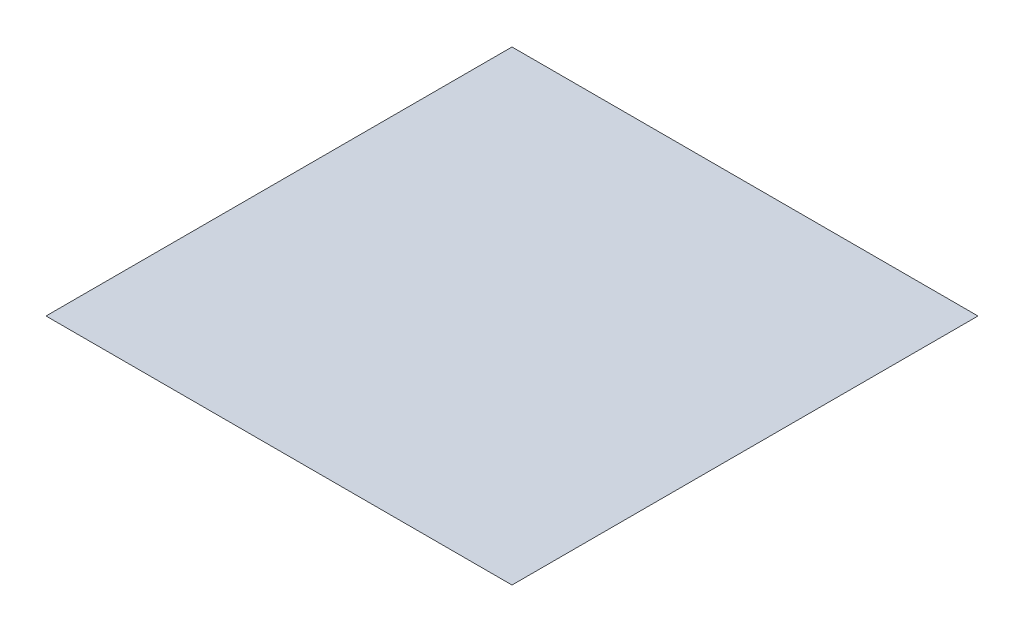
ISO-10303-21;
HEADER;
FILE_DESCRIPTION(('STEP AP214'),'2;1');
FILE_NAME('part.step','',(''),(''),'','','');
FILE_SCHEMA(('AUTOMOTIVE_DESIGN { 1 0 10303 214 1 1 1 1 }'));
ENDSEC;
DATA;
#1=APPLICATION_CONTEXT('core data for automotive mechanical design processes');
#2=APPLICATION_PROTOCOL_DEFINITION('international standard','automotive_design',2000,#1);
#3=PRODUCT_CONTEXT('',#1,'mechanical');
#4=PRODUCT('Part','Part','',(#3));
#5=PRODUCT_RELATED_PRODUCT_CATEGORY('part','',(#4));
#6=PRODUCT_DEFINITION_FORMATION('','',#4);
#7=PRODUCT_DEFINITION_CONTEXT('part definition',#1,'design');
#8=PRODUCT_DEFINITION('design','',#6,#7);
#9=PRODUCT_DEFINITION_SHAPE('','',#8);
#10=(LENGTH_UNIT() NAMED_UNIT(*) SI_UNIT(.MILLI.,.METRE.));
#11=(NAMED_UNIT(*) PLANE_ANGLE_UNIT() SI_UNIT($,.RADIAN.));
#12=(NAMED_UNIT(*) SI_UNIT($,.STERADIAN.) SOLID_ANGLE_UNIT());
#13=UNCERTAINTY_MEASURE_WITH_UNIT(LENGTH_MEASURE(1.E-05),#10,'distance_accuracy_value','');
#14=(GEOMETRIC_REPRESENTATION_CONTEXT(3) GLOBAL_UNCERTAINTY_ASSIGNED_CONTEXT((#13)) GLOBAL_UNIT_ASSIGNED_CONTEXT((#10,
#11,#12)) REPRESENTATION_CONTEXT('',''));
#15=CARTESIAN_POINT('',(0.,0.,0.));
#16=DIRECTION('',(0.,0.,1.));
#17=DIRECTION('',(1.,0.,0.));
#18=AXIS2_PLACEMENT_3D('',#15,#16,#17);
#19=CARTESIAN_POINT('',(0.,0.,0.));
#20=DIRECTION('',(0.,-1.,0.));
#21=DIRECTION('',(0.,0.,-1.));
#22=AXIS2_PLACEMENT_3D('',#19,#20,#21);
#23=PLANE('',#22);
#24=DIRECTION('',(0.,0.,-1.));
#25=VECTOR('',#24,1.);
#26=CARTESIAN_POINT('',(500.,0.,500.));
#27=LINE('',#26,#25);
#28=CARTESIAN_POINT('',(500.,0.,500.));
#29=VERTEX_POINT('',#28);
#30=CARTESIAN_POINT('',(500.,0.,-500.));
#31=VERTEX_POINT('',#30);
#32=EDGE_CURVE('E152',#29,#31,#27,.T.);
#33=ORIENTED_EDGE('',*,*,#32,.T.);
#34=DIRECTION('',(-1.,0.,0.));
#35=VECTOR('',#34,1.);
#36=CARTESIAN_POINT('',(-500.,0.,-500.));
#37=LINE('',#36,#35);
#38=CARTESIAN_POINT('',(-500.,0.,-500.));
#39=VERTEX_POINT('',#38);
#40=EDGE_CURVE('E70',#31,#39,#37,.T.);
#41=ORIENTED_EDGE('',*,*,#40,.T.);
#42=DIRECTION('',(0.,0.,1.));
#43=VECTOR('',#42,1.);
#44=CARTESIAN_POINT('',(-500.,0.,500.));
#45=LINE('',#44,#43);
#46=CARTESIAN_POINT('',(-500.,0.,500.));
#47=VERTEX_POINT('',#46);
#48=EDGE_CURVE('E218',#39,#47,#45,.T.);
#49=ORIENTED_EDGE('',*,*,#48,.T.);
#50=DIRECTION('',(1.,0.,0.));
#51=VECTOR('',#50,1.);
#52=CARTESIAN_POINT('',(-500.,0.,500.));
#53=LINE('',#52,#51);
#54=EDGE_CURVE('E158',#47,#29,#53,.T.);
#55=ORIENTED_EDGE('',*,*,#54,.T.);
#56=EDGE_LOOP('',(#33,#41,#49,#55));
#57=FACE_BOUND('',#56,.T.);
#58=ADVANCED_FACE('F45',(#57),#23,.F.);
#59=CARTESIAN_POINT('',(-195.121951219512,-243.90243902439,0.));
#60=DIRECTION('',(0.624695047554424,0.78086880944303,0.));
#61=DIRECTION('',(-0.78086880944303,0.624695047554424,0.));
#62=AXIS2_PLACEMENT_3D('',#59,#60,#61);
#63=PLANE('',#62);
#64=DIRECTION('',(0.615457454896664,-0.492365963917331,0.615457454896664));
#65=VECTOR('',#64,1.);
#66=CARTESIAN_POINT('',(-500.,0.,-500.));
#67=LINE('',#66,#65);
#68=CARTESIAN_POINT('',(-75.0000000000011,-340.000000000001,-74.9999999999985));
#69=VERTEX_POINT('',#68);
#70=EDGE_CURVE('E217',#39,#69,#67,.T.);
#71=ORIENTED_EDGE('',*,*,#70,.T.);
#72=DIRECTION('',(0.,0.,1.));
#73=VECTOR('',#72,1.);
#74=CARTESIAN_POINT('',(-75.0000000000011,-339.999999999999,0.));
#75=LINE('',#74,#73);
#76=CARTESIAN_POINT('',(-75.0000000000011,-339.999999999999,75.0000000000015));
#77=VERTEX_POINT('',#76);
#78=EDGE_CURVE('E111',#69,#77,#75,.T.);
#79=ORIENTED_EDGE('',*,*,#78,.T.);
#80=DIRECTION('',(0.615457454896664,-0.492365963917331,-0.615457454896664));
#81=VECTOR('',#80,1.);
#82=CARTESIAN_POINT('',(-500.,0.,500.));
#83=LINE('',#82,#81);
#84=EDGE_CURVE('E164',#47,#77,#83,.T.);
#85=ORIENTED_EDGE('',*,*,#84,.F.);
#86=ORIENTED_EDGE('',*,*,#48,.F.);
#87=EDGE_LOOP('',(#71,#79,#85,#86));
#88=FACE_BOUND('',#87,.T.);
#89=ADVANCED_FACE('F176',(#88),#63,.F.);
#90=CARTESIAN_POINT('',(0.,-243.90243902439,195.121951219512));
#91=DIRECTION('',(0.,0.78086880944303,-0.624695047554424));
#92=DIRECTION('',(0.,0.624695047554424,0.78086880944303));
#93=AXIS2_PLACEMENT_3D('',#90,#91,#92);
#94=PLANE('',#93);
#95=ORIENTED_EDGE('',*,*,#84,.T.);
#96=DIRECTION('',(1.,0.,0.));
#97=VECTOR('',#96,1.);
#98=CARTESIAN_POINT('',(0.,-339.999999999999,75.0000000000015));
#99=LINE('',#98,#97);
#100=CARTESIAN_POINT('',(74.9999999999989,-340.000000000001,75.0000000000015));
#101=VERTEX_POINT('',#100);
#102=EDGE_CURVE('E146',#77,#101,#99,.T.);
#103=ORIENTED_EDGE('',*,*,#102,.T.);
#104=DIRECTION('',(-0.615457454896663,-0.492365963917331,-0.615457454896664));
#105=VECTOR('',#104,1.);
#106=CARTESIAN_POINT('',(500.,0.,500.));
#107=LINE('',#106,#105);
#108=EDGE_CURVE('E55',#29,#101,#107,.T.);
#109=ORIENTED_EDGE('',*,*,#108,.F.);
#110=ORIENTED_EDGE('',*,*,#54,.F.);
#111=EDGE_LOOP('',(#95,#103,#109,#110));
#112=FACE_BOUND('',#111,.T.);
#113=ADVANCED_FACE('F166',(#112),#94,.F.);
#114=CARTESIAN_POINT('',(0.,-243.90243902439,-195.121951219512));
#115=DIRECTION('',(0.,0.78086880944303,0.624695047554424));
#116=DIRECTION('',(0.,-0.624695047554424,0.78086880944303));
#117=AXIS2_PLACEMENT_3D('',#114,#115,#116);
#118=PLANE('',#117);
#119=DIRECTION('',(-0.615457454896664,-0.492365963917331,0.615457454896664));
#120=VECTOR('',#119,1.);
#121=CARTESIAN_POINT('',(500.,0.,-500.));
#122=LINE('',#121,#120);
#123=CARTESIAN_POINT('',(74.9999999999984,-340.000000000001,-74.9999999999985));
#124=VERTEX_POINT('',#123);
#125=EDGE_CURVE('E186',#31,#124,#122,.T.);
#126=ORIENTED_EDGE('',*,*,#125,.T.);
#127=DIRECTION('',(-1.,0.,0.));
#128=VECTOR('',#127,1.);
#129=CARTESIAN_POINT('',(0.,-340.000000000001,-74.9999999999985));
#130=LINE('',#129,#128);
#131=EDGE_CURVE('E137',#124,#69,#130,.T.);
#132=ORIENTED_EDGE('',*,*,#131,.T.);
#133=ORIENTED_EDGE('',*,*,#70,.F.);
#134=ORIENTED_EDGE('',*,*,#40,.F.);
#135=EDGE_LOOP('',(#126,#132,#133,#134));
#136=FACE_BOUND('',#135,.T.);
#137=ADVANCED_FACE('F175',(#136),#118,.F.);
#138=CARTESIAN_POINT('',(195.121951219512,-243.90243902439,0.));
#139=DIRECTION('',(-0.624695047554424,0.78086880944303,0.));
#140=DIRECTION('',(-0.78086880944303,-0.624695047554424,0.));
#141=AXIS2_PLACEMENT_3D('',#138,#139,#140);
#142=PLANE('',#141);
#143=ORIENTED_EDGE('',*,*,#108,.T.);
#144=DIRECTION('',(0.,0.,-1.));
#145=VECTOR('',#144,1.);
#146=CARTESIAN_POINT('',(74.9999999999989,-340.000000000001,0.));
#147=LINE('',#146,#145);
#148=EDGE_CURVE('E12',#101,#124,#147,.T.);
#149=ORIENTED_EDGE('',*,*,#148,.T.);
#150=ORIENTED_EDGE('',*,*,#125,.F.);
#151=ORIENTED_EDGE('',*,*,#32,.F.);
#152=EDGE_LOOP('',(#143,#149,#150,#151));
#153=FACE_BOUND('',#152,.T.);
#154=ADVANCED_FACE('F47',(#153),#142,.F.);
#155=CARTESIAN_POINT('',(-75.0000000000008,-299.999999999999,75.0000000000015));
#156=DIRECTION('',(-1.,0.,0.));
#157=DIRECTION('',(0.,-1.,0.));
#158=AXIS2_PLACEMENT_3D('',#155,#156,#157);
#159=PLANE('',#158);
#160=DIRECTION('',(0.,-1.,0.));
#161=VECTOR('',#160,1.);
#162=CARTESIAN_POINT('',(-75.0000000000008,-299.999999999999,-74.9999999999985));
#163=LINE('',#162,#161);
#164=CARTESIAN_POINT('',(-75.0000000000008,-299.999999999999,-74.9999999999985));
#165=VERTEX_POINT('',#164);
#166=EDGE_CURVE('E103',#165,#69,#163,.T.);
#167=ORIENTED_EDGE('',*,*,#166,.F.);
#168=DIRECTION('',(0.,0.,-1.));
#169=VECTOR('',#168,1.);
#170=CARTESIAN_POINT('',(-75.0000000000008,-299.999999999999,75.0000000000015));
#171=LINE('',#170,#169);
#172=CARTESIAN_POINT('',(-75.0000000000008,-299.999999999999,75.0000000000015));
#173=VERTEX_POINT('',#172);
#174=EDGE_CURVE('E108',#173,#165,#171,.T.);
#175=ORIENTED_EDGE('',*,*,#174,.F.);
#176=DIRECTION('',(0.,-1.,0.));
#177=VECTOR('',#176,1.);
#178=CARTESIAN_POINT('',(-75.0000000000008,-299.999999999999,75.0000000000015));
#179=LINE('',#178,#177);
#180=EDGE_CURVE('E134',#173,#77,#179,.T.);
#181=ORIENTED_EDGE('',*,*,#180,.T.);
#182=ORIENTED_EDGE('',*,*,#78,.F.);
#183=EDGE_LOOP('',(#167,#175,#181,#182));
#184=FACE_BOUND('',#183,.T.);
#185=ADVANCED_FACE('F105',(#184),#159,.F.);
#186=CARTESIAN_POINT('',(74.9999999999992,-300.000000000001,75.0000000000015));
#187=DIRECTION('',(0.,0.,1.));
#188=DIRECTION('',(1.,0.,0.));
#189=AXIS2_PLACEMENT_3D('',#186,#187,#188);
#190=PLANE('',#189);
#191=ORIENTED_EDGE('',*,*,#180,.F.);
#192=DIRECTION('',(-1.,0.,0.));
#193=VECTOR('',#192,1.);
#194=CARTESIAN_POINT('',(74.9999999999992,-300.000000000001,75.0000000000015));
#195=LINE('',#194,#193);
#196=CARTESIAN_POINT('',(74.9999999999992,-300.000000000001,75.0000000000015));
#197=VERTEX_POINT('',#196);
#198=EDGE_CURVE('E115',#197,#173,#195,.T.);
#199=ORIENTED_EDGE('',*,*,#198,.F.);
#200=DIRECTION('',(0.,-1.,0.));
#201=VECTOR('',#200,1.);
#202=CARTESIAN_POINT('',(74.9999999999992,-300.000000000001,75.0000000000015));
#203=LINE('',#202,#201);
#204=EDGE_CURVE('E138',#197,#101,#203,.T.);
#205=ORIENTED_EDGE('',*,*,#204,.T.);
#206=ORIENTED_EDGE('',*,*,#102,.F.);
#207=EDGE_LOOP('',(#191,#199,#205,#206));
#208=FACE_BOUND('',#207,.T.);
#209=ADVANCED_FACE('F286',(#208),#190,.F.);
#210=CARTESIAN_POINT('',(74.9999999999992,-300.000000000001,75.0000000000015));
#211=DIRECTION('',(1.,0.,0.));
#212=DIRECTION('',(0.,1.,0.));
#213=AXIS2_PLACEMENT_3D('',#210,#211,#212);
#214=PLANE('',#213);
#215=ORIENTED_EDGE('',*,*,#204,.F.);
#216=DIRECTION('',(0.,0.,1.));
#217=VECTOR('',#216,1.);
#218=CARTESIAN_POINT('',(74.9999999999992,-300.000000000001,75.0000000000015));
#219=LINE('',#218,#217);
#220=CARTESIAN_POINT('',(74.9999999999992,-300.000000000001,-74.9999999999985));
#221=VERTEX_POINT('',#220);
#222=EDGE_CURVE('E123',#221,#197,#219,.T.);
#223=ORIENTED_EDGE('',*,*,#222,.F.);
#224=DIRECTION('',(0.,-1.,0.));
#225=VECTOR('',#224,1.);
#226=CARTESIAN_POINT('',(74.9999999999992,-300.000000000001,-74.9999999999985));
#227=LINE('',#226,#225);
#228=EDGE_CURVE('E62',#221,#124,#227,.T.);
#229=ORIENTED_EDGE('',*,*,#228,.T.);
#230=ORIENTED_EDGE('',*,*,#148,.F.);
#231=EDGE_LOOP('',(#215,#223,#229,#230));
#232=FACE_BOUND('',#231,.T.);
#233=ADVANCED_FACE('F284',(#232),#214,.F.);
#234=CARTESIAN_POINT('',(74.9999999999992,-300.000000000001,-74.9999999999985));
#235=DIRECTION('',(0.,0.,-1.));
#236=DIRECTION('',(-1.,0.,0.));
#237=AXIS2_PLACEMENT_3D('',#234,#235,#236);
#238=PLANE('',#237);
#239=ORIENTED_EDGE('',*,*,#228,.F.);
#240=DIRECTION('',(1.,0.,0.));
#241=VECTOR('',#240,1.);
#242=CARTESIAN_POINT('',(74.9999999999992,-300.000000000001,-74.9999999999985));
#243=LINE('',#242,#241);
#244=EDGE_CURVE('E118',#165,#221,#243,.T.);
#245=ORIENTED_EDGE('',*,*,#244,.F.);
#246=ORIENTED_EDGE('',*,*,#166,.T.);
#247=ORIENTED_EDGE('',*,*,#131,.F.);
#248=EDGE_LOOP('',(#239,#245,#246,#247));
#249=FACE_BOUND('',#248,.T.);
#250=ADVANCED_FACE('F119',(#249),#238,.F.);
#251=CARTESIAN_POINT('',(-1.96623899133175E-12,-300.,0.));
#252=DIRECTION('',(0.,1.,0.));
#253=DIRECTION('',(-1.,0.,0.));
#254=AXIS2_PLACEMENT_3D('',#251,#252,#253);
#255=PLANE('',#254);
#256=ORIENTED_EDGE('',*,*,#174,.T.);
#257=ORIENTED_EDGE('',*,*,#244,.T.);
#258=ORIENTED_EDGE('',*,*,#222,.T.);
#259=ORIENTED_EDGE('',*,*,#198,.T.);
#260=EDGE_LOOP('',(#256,#257,#258,#259));
#261=FACE_BOUND('',#260,.T.);
#262=ADVANCED_FACE('F125',(#261),#255,.F.);
#263=CLOSED_SHELL('',(#58,#89,#113,#137,#154,#185,#209,#233,#250,#262));
#264=MANIFOLD_SOLID_BREP('B2',#263);
#265=ADVANCED_BREP_SHAPE_REPRESENTATION('',(#18,#264),#14);
#266=SHAPE_DEFINITION_REPRESENTATION(#9,#265);
ENDSEC;
END-ISO-10303-21;
